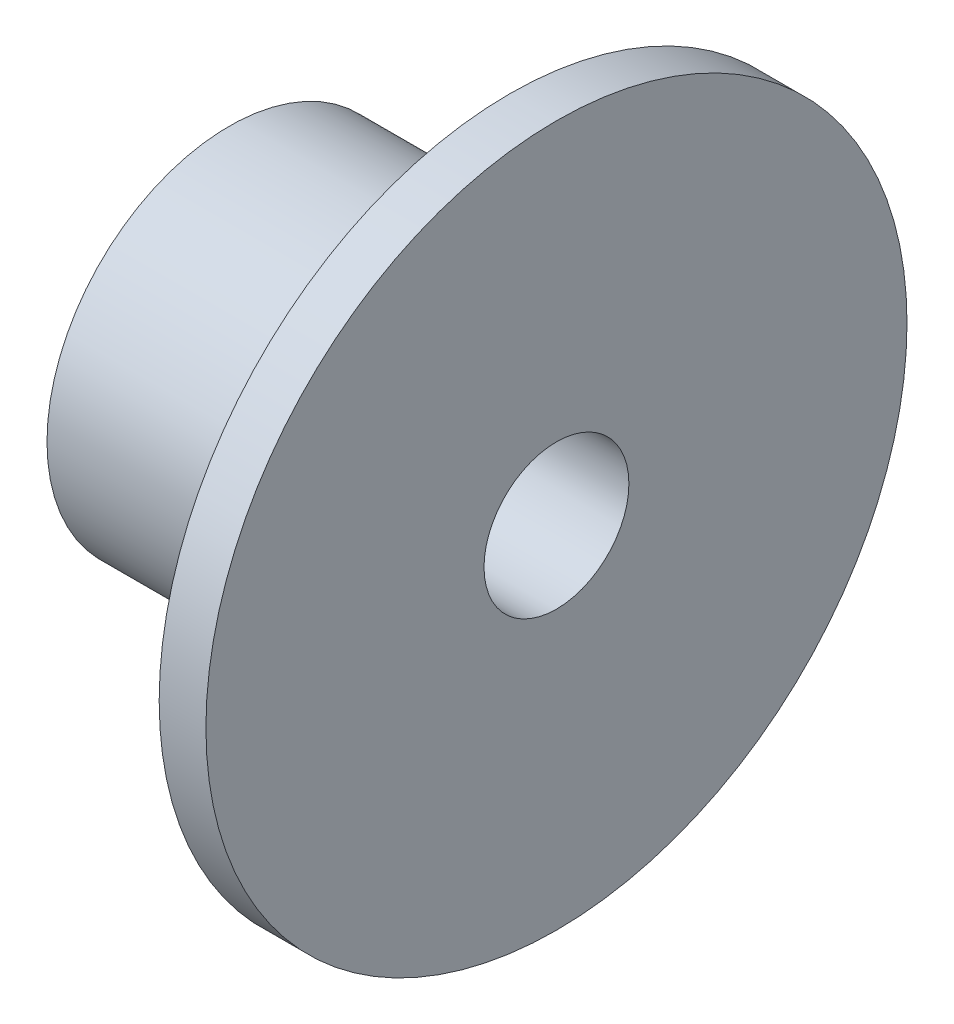
ISO-10303-21;
HEADER;
FILE_DESCRIPTION(('STEP AP214'),'2;1');
FILE_NAME('part.step','',(''),(''),'','','');
FILE_SCHEMA(('AUTOMOTIVE_DESIGN { 1 0 10303 214 1 1 1 1 }'));
ENDSEC;
DATA;
#1=APPLICATION_CONTEXT('core data for automotive mechanical design processes');
#2=APPLICATION_PROTOCOL_DEFINITION('international standard','automotive_design',2000,#1);
#3=PRODUCT_CONTEXT('',#1,'mechanical');
#4=PRODUCT('Part','Part','',(#3));
#5=PRODUCT_RELATED_PRODUCT_CATEGORY('part','',(#4));
#6=PRODUCT_DEFINITION_FORMATION('','',#4);
#7=PRODUCT_DEFINITION_CONTEXT('part definition',#1,'design');
#8=PRODUCT_DEFINITION('design','',#6,#7);
#9=PRODUCT_DEFINITION_SHAPE('','',#8);
#10=(LENGTH_UNIT() NAMED_UNIT(*) SI_UNIT(.MILLI.,.METRE.));
#11=(NAMED_UNIT(*) PLANE_ANGLE_UNIT() SI_UNIT($,.RADIAN.));
#12=(NAMED_UNIT(*) SI_UNIT($,.STERADIAN.) SOLID_ANGLE_UNIT());
#13=UNCERTAINTY_MEASURE_WITH_UNIT(LENGTH_MEASURE(1.E-05),#10,'distance_accuracy_value','');
#14=(GEOMETRIC_REPRESENTATION_CONTEXT(3) GLOBAL_UNCERTAINTY_ASSIGNED_CONTEXT((#13)) GLOBAL_UNIT_ASSIGNED_CONTEXT((#10,
#11,#12)) REPRESENTATION_CONTEXT('',''));
#15=CARTESIAN_POINT('',(0.,0.,0.));
#16=DIRECTION('',(0.,0.,1.));
#17=DIRECTION('',(1.,0.,0.));
#18=AXIS2_PLACEMENT_3D('',#15,#16,#17);
#19=CARTESIAN_POINT('',(6.,0.,0.));
#20=DIRECTION('',(-1.,0.,0.));
#21=DIRECTION('',(0.,0.,1.));
#22=AXIS2_PLACEMENT_3D('',#19,#20,#21);
#23=CYLINDRICAL_SURFACE('',#22,1.55);
#24=CARTESIAN_POINT('',(7.,0.,0.));
#25=DIRECTION('',(1.,0.,0.));
#26=DIRECTION('',(0.,0.,-1.));
#27=AXIS2_PLACEMENT_3D('',#24,#25,#26);
#28=CIRCLE('',#27,1.55);
#29=CARTESIAN_POINT('',(7.,0.,-1.55));
#30=VERTEX_POINT('',#29);
#31=EDGE_CURVE('E164',#30,#30,#28,.T.);
#32=ORIENTED_EDGE('',*,*,#31,.T.);
#33=EDGE_LOOP('',(#32));
#34=FACE_BOUND('',#33,.T.);
#35=CARTESIAN_POINT('',(3.,0.,0.));
#36=DIRECTION('',(-1.,0.,0.));
#37=DIRECTION('',(0.,0.,1.));
#38=AXIS2_PLACEMENT_3D('',#35,#36,#37);
#39=CIRCLE('',#38,1.55);
#40=CARTESIAN_POINT('',(3.,0.,1.55));
#41=VERTEX_POINT('',#40);
#42=EDGE_CURVE('E154',#41,#41,#39,.T.);
#43=ORIENTED_EDGE('',*,*,#42,.T.);
#44=EDGE_LOOP('',(#43));
#45=FACE_BOUND('',#44,.T.);
#46=ADVANCED_FACE('F39',(#34,#45),#23,.F.);
#47=CARTESIAN_POINT('',(0.,0.,0.));
#48=DIRECTION('',(1.,0.,0.));
#49=DIRECTION('',(0.,0.,-1.));
#50=AXIS2_PLACEMENT_3D('',#47,#48,#49);
#51=PLANE('',#50);
#52=DIRECTION('',(0.,0.866025403784439,0.5));
#53=VECTOR('',#52,1.);
#54=CARTESIAN_POINT('',(0.,-2.95,1.7031832941094));
#55=LINE('',#54,#53);
#56=CARTESIAN_POINT('',(0.,-2.95,1.7031832941094));
#57=VERTEX_POINT('',#56);
#58=CARTESIAN_POINT('',(0.,0.,3.40636658821879));
#59=VERTEX_POINT('',#58);
#60=EDGE_CURVE('E135',#57,#59,#55,.T.);
#61=ORIENTED_EDGE('',*,*,#60,.F.);
#62=DIRECTION('',(0.,0.,1.));
#63=VECTOR('',#62,1.);
#64=CARTESIAN_POINT('',(0.,-2.95,-1.7031832941094));
#65=LINE('',#64,#63);
#66=CARTESIAN_POINT('',(0.,-2.95,-1.7031832941094));
#67=VERTEX_POINT('',#66);
#68=EDGE_CURVE('E55',#67,#57,#65,.T.);
#69=ORIENTED_EDGE('',*,*,#68,.F.);
#70=DIRECTION('',(0.,-0.866025403784439,0.5));
#71=VECTOR('',#70,1.);
#72=CARTESIAN_POINT('',(0.,0.,-3.40636658821879));
#73=LINE('',#72,#71);
#74=CARTESIAN_POINT('',(0.,0.,-3.40636658821879));
#75=VERTEX_POINT('',#74);
#76=EDGE_CURVE('E148',#75,#67,#73,.T.);
#77=ORIENTED_EDGE('',*,*,#76,.F.);
#78=DIRECTION('',(0.,-0.866025403784439,-0.5));
#79=VECTOR('',#78,1.);
#80=CARTESIAN_POINT('',(0.,2.95,-1.7031832941094));
#81=LINE('',#80,#79);
#82=CARTESIAN_POINT('',(0.,2.95,-1.7031832941094));
#83=VERTEX_POINT('',#82);
#84=EDGE_CURVE('E145',#83,#75,#81,.T.);
#85=ORIENTED_EDGE('',*,*,#84,.F.);
#86=DIRECTION('',(0.,0.,-1.));
#87=VECTOR('',#86,1.);
#88=CARTESIAN_POINT('',(0.,2.95,1.7031832941094));
#89=LINE('',#88,#87);
#90=CARTESIAN_POINT('',(0.,2.95,1.7031832941094));
#91=VERTEX_POINT('',#90);
#92=EDGE_CURVE('E103',#91,#83,#89,.T.);
#93=ORIENTED_EDGE('',*,*,#92,.F.);
#94=DIRECTION('',(0.,0.866025403784438,-0.5));
#95=VECTOR('',#94,1.);
#96=CARTESIAN_POINT('',(0.,0.,3.40636658821879));
#97=LINE('',#96,#95);
#98=EDGE_CURVE('E139',#59,#91,#97,.T.);
#99=ORIENTED_EDGE('',*,*,#98,.F.);
#100=EDGE_LOOP('',(#61,#69,#77,#85,#93,#99));
#101=FACE_BOUND('',#100,.T.);
#102=CARTESIAN_POINT('',(0.,0.,0.));
#103=DIRECTION('',(1.,0.,0.));
#104=DIRECTION('',(0.,0.,-1.));
#105=AXIS2_PLACEMENT_3D('',#102,#103,#104);
#106=CIRCLE('',#105,3.9);
#107=CARTESIAN_POINT('',(0.,0.,-3.9));
#108=VERTEX_POINT('',#107);
#109=EDGE_CURVE('E173',#108,#108,#106,.T.);
#110=ORIENTED_EDGE('',*,*,#109,.F.);
#111=EDGE_LOOP('',(#110));
#112=FACE_BOUND('',#111,.T.);
#113=ADVANCED_FACE('F199',(#101,#112),#51,.F.);
#114=CARTESIAN_POINT('',(6.,0.,0.));
#115=DIRECTION('',(-1.,0.,0.));
#116=DIRECTION('',(0.,0.,1.));
#117=AXIS2_PLACEMENT_3D('',#114,#115,#116);
#118=CYLINDRICAL_SURFACE('',#117,3.9);
#119=CARTESIAN_POINT('',(5.,0.,0.));
#120=DIRECTION('',(1.,0.,0.));
#121=DIRECTION('',(0.,0.,-1.));
#122=AXIS2_PLACEMENT_3D('',#119,#120,#121);
#123=CIRCLE('',#122,3.9);
#124=CARTESIAN_POINT('',(5.,0.,-3.9));
#125=VERTEX_POINT('',#124);
#126=EDGE_CURVE('E11',#125,#125,#123,.F.);
#127=ORIENTED_EDGE('',*,*,#126,.T.);
#128=EDGE_LOOP('',(#127));
#129=FACE_BOUND('',#128,.T.);
#130=ORIENTED_EDGE('',*,*,#109,.T.);
#131=EDGE_LOOP('',(#130));
#132=FACE_BOUND('',#131,.T.);
#133=ADVANCED_FACE('F205',(#129,#132),#118,.T.);
#134=CARTESIAN_POINT('',(7.,0.,0.));
#135=DIRECTION('',(1.,0.,0.));
#136=DIRECTION('',(0.,0.,-1.));
#137=AXIS2_PLACEMENT_3D('',#134,#135,#136);
#138=PLANE('',#137);
#139=CARTESIAN_POINT('',(7.,0.,0.));
#140=DIRECTION('',(1.,0.,0.));
#141=DIRECTION('',(0.,0.,-1.));
#142=AXIS2_PLACEMENT_3D('',#139,#140,#141);
#143=CIRCLE('',#142,7.5);
#144=CARTESIAN_POINT('',(7.,0.,-7.5));
#145=VERTEX_POINT('',#144);
#146=EDGE_CURVE('E169',#145,#145,#143,.T.);
#147=ORIENTED_EDGE('',*,*,#146,.T.);
#148=EDGE_LOOP('',(#147));
#149=FACE_BOUND('',#148,.T.);
#150=ORIENTED_EDGE('',*,*,#31,.F.);
#151=EDGE_LOOP('',(#150));
#152=FACE_BOUND('',#151,.T.);
#153=ADVANCED_FACE('F213',(#149,#152),#138,.T.);
#154=CARTESIAN_POINT('',(6.,0.,0.));
#155=DIRECTION('',(1.,0.,0.));
#156=DIRECTION('',(0.,0.,-1.));
#157=AXIS2_PLACEMENT_3D('',#154,#155,#156);
#158=PLANE('',#157);
#159=CARTESIAN_POINT('',(6.,0.,0.));
#160=DIRECTION('',(1.,0.,0.));
#161=DIRECTION('',(0.,0.,-1.));
#162=AXIS2_PLACEMENT_3D('',#159,#160,#161);
#163=CIRCLE('',#162,4.9);
#164=CARTESIAN_POINT('',(6.,0.,-4.9));
#165=VERTEX_POINT('',#164);
#166=EDGE_CURVE('E48',#165,#165,#163,.T.);
#167=ORIENTED_EDGE('',*,*,#166,.T.);
#168=EDGE_LOOP('',(#167));
#169=FACE_BOUND('',#168,.T.);
#170=CARTESIAN_POINT('',(6.,0.,0.));
#171=DIRECTION('',(1.,0.,0.));
#172=DIRECTION('',(0.,0.,-1.));
#173=AXIS2_PLACEMENT_3D('',#170,#171,#172);
#174=CIRCLE('',#173,7.5);
#175=CARTESIAN_POINT('',(6.,0.,-7.5));
#176=VERTEX_POINT('',#175);
#177=EDGE_CURVE('E168',#176,#176,#174,.T.);
#178=ORIENTED_EDGE('',*,*,#177,.F.);
#179=EDGE_LOOP('',(#178));
#180=FACE_BOUND('',#179,.T.);
#181=ADVANCED_FACE('F186',(#169,#180),#158,.F.);
#182=CARTESIAN_POINT('',(7.,0.,0.));
#183=DIRECTION('',(-1.,0.,0.));
#184=DIRECTION('',(0.,0.,1.));
#185=AXIS2_PLACEMENT_3D('',#182,#183,#184);
#186=CYLINDRICAL_SURFACE('',#185,7.5);
#187=ORIENTED_EDGE('',*,*,#146,.F.);
#188=EDGE_LOOP('',(#187));
#189=FACE_BOUND('',#188,.T.);
#190=ORIENTED_EDGE('',*,*,#177,.T.);
#191=EDGE_LOOP('',(#190));
#192=FACE_BOUND('',#191,.T.);
#193=ADVANCED_FACE('F210',(#189,#192),#186,.T.);
#194=CARTESIAN_POINT('',(3.,-2.95,-1.7031832941094));
#195=DIRECTION('',(0.,-1.,0.));
#196=DIRECTION('',(0.,0.,-1.));
#197=AXIS2_PLACEMENT_3D('',#194,#195,#196);
#198=PLANE('',#197);
#199=ORIENTED_EDGE('',*,*,#68,.T.);
#200=DIRECTION('',(-1.,0.,0.));
#201=VECTOR('',#200,1.);
#202=CARTESIAN_POINT('',(3.,-2.95,1.7031832941094));
#203=LINE('',#202,#201);
#204=CARTESIAN_POINT('',(3.,-2.95,1.7031832941094));
#205=VERTEX_POINT('',#204);
#206=EDGE_CURVE('E85',#205,#57,#203,.T.);
#207=ORIENTED_EDGE('',*,*,#206,.F.);
#208=DIRECTION('',(0.,0.,1.));
#209=VECTOR('',#208,1.);
#210=CARTESIAN_POINT('',(3.,-2.95,-1.7031832941094));
#211=LINE('',#210,#209);
#212=CARTESIAN_POINT('',(3.,-2.95,-1.7031832941094));
#213=VERTEX_POINT('',#212);
#214=EDGE_CURVE('E151',#213,#205,#211,.T.);
#215=ORIENTED_EDGE('',*,*,#214,.F.);
#216=DIRECTION('',(-1.,0.,0.));
#217=VECTOR('',#216,1.);
#218=CARTESIAN_POINT('',(3.,-2.95,-1.7031832941094));
#219=LINE('',#218,#217);
#220=EDGE_CURVE('E63',#213,#67,#219,.T.);
#221=ORIENTED_EDGE('',*,*,#220,.T.);
#222=EDGE_LOOP('',(#199,#207,#215,#221));
#223=FACE_BOUND('',#222,.T.);
#224=ADVANCED_FACE('F228',(#223),#198,.F.);
#225=CARTESIAN_POINT('',(3.,0.,-3.40636658821879));
#226=DIRECTION('',(0.,-0.5,-0.866025403784439));
#227=DIRECTION('',(0.,0.866025403784439,-0.5));
#228=AXIS2_PLACEMENT_3D('',#225,#226,#227);
#229=PLANE('',#228);
#230=ORIENTED_EDGE('',*,*,#76,.T.);
#231=ORIENTED_EDGE('',*,*,#220,.F.);
#232=DIRECTION('',(0.,-0.866025403784439,0.5));
#233=VECTOR('',#232,1.);
#234=CARTESIAN_POINT('',(3.,0.,-3.40636658821879));
#235=LINE('',#234,#233);
#236=CARTESIAN_POINT('',(3.,0.,-3.40636658821879));
#237=VERTEX_POINT('',#236);
#238=EDGE_CURVE('E117',#237,#213,#235,.T.);
#239=ORIENTED_EDGE('',*,*,#238,.F.);
#240=DIRECTION('',(-1.,0.,0.));
#241=VECTOR('',#240,1.);
#242=CARTESIAN_POINT('',(3.,0.,-3.40636658821879));
#243=LINE('',#242,#241);
#244=EDGE_CURVE('E108',#237,#75,#243,.T.);
#245=ORIENTED_EDGE('',*,*,#244,.T.);
#246=EDGE_LOOP('',(#230,#231,#239,#245));
#247=FACE_BOUND('',#246,.T.);
#248=ADVANCED_FACE('F231',(#247),#229,.F.);
#249=CARTESIAN_POINT('',(3.,2.95,-1.7031832941094));
#250=DIRECTION('',(0.,0.5,-0.866025403784439));
#251=DIRECTION('',(0.,0.866025403784439,0.5));
#252=AXIS2_PLACEMENT_3D('',#249,#250,#251);
#253=PLANE('',#252);
#254=ORIENTED_EDGE('',*,*,#84,.T.);
#255=ORIENTED_EDGE('',*,*,#244,.F.);
#256=DIRECTION('',(0.,-0.866025403784439,-0.5));
#257=VECTOR('',#256,1.);
#258=CARTESIAN_POINT('',(3.,2.95,-1.7031832941094));
#259=LINE('',#258,#257);
#260=CARTESIAN_POINT('',(3.,2.95,-1.7031832941094));
#261=VERTEX_POINT('',#260);
#262=EDGE_CURVE('E112',#261,#237,#259,.T.);
#263=ORIENTED_EDGE('',*,*,#262,.F.);
#264=DIRECTION('',(-1.,0.,0.));
#265=VECTOR('',#264,1.);
#266=CARTESIAN_POINT('',(3.,2.95,-1.7031832941094));
#267=LINE('',#266,#265);
#268=EDGE_CURVE('E96',#261,#83,#267,.T.);
#269=ORIENTED_EDGE('',*,*,#268,.T.);
#270=EDGE_LOOP('',(#254,#255,#263,#269));
#271=FACE_BOUND('',#270,.T.);
#272=ADVANCED_FACE('F113',(#271),#253,.F.);
#273=CARTESIAN_POINT('',(3.,2.95,1.7031832941094));
#274=DIRECTION('',(0.,1.,0.));
#275=DIRECTION('',(0.,0.,1.));
#276=AXIS2_PLACEMENT_3D('',#273,#274,#275);
#277=PLANE('',#276);
#278=ORIENTED_EDGE('',*,*,#92,.T.);
#279=ORIENTED_EDGE('',*,*,#268,.F.);
#280=DIRECTION('',(0.,0.,-1.));
#281=VECTOR('',#280,1.);
#282=CARTESIAN_POINT('',(3.,2.95,1.7031832941094));
#283=LINE('',#282,#281);
#284=CARTESIAN_POINT('',(3.,2.95,1.7031832941094));
#285=VERTEX_POINT('',#284);
#286=EDGE_CURVE('E100',#285,#261,#283,.T.);
#287=ORIENTED_EDGE('',*,*,#286,.F.);
#288=DIRECTION('',(-1.,0.,0.));
#289=VECTOR('',#288,1.);
#290=CARTESIAN_POINT('',(3.,2.95,1.7031832941094));
#291=LINE('',#290,#289);
#292=EDGE_CURVE('E109',#285,#91,#291,.T.);
#293=ORIENTED_EDGE('',*,*,#292,.T.);
#294=EDGE_LOOP('',(#278,#279,#287,#293));
#295=FACE_BOUND('',#294,.T.);
#296=ADVANCED_FACE('F98',(#295),#277,.F.);
#297=CARTESIAN_POINT('',(3.,0.,3.40636658821879));
#298=DIRECTION('',(0.,0.5,0.866025403784439));
#299=DIRECTION('',(0.,-0.866025403784439,0.5));
#300=AXIS2_PLACEMENT_3D('',#297,#298,#299);
#301=PLANE('',#300);
#302=ORIENTED_EDGE('',*,*,#98,.T.);
#303=ORIENTED_EDGE('',*,*,#292,.F.);
#304=DIRECTION('',(0.,0.866025403784438,-0.5));
#305=VECTOR('',#304,1.);
#306=CARTESIAN_POINT('',(3.,0.,3.40636658821879));
#307=LINE('',#306,#305);
#308=CARTESIAN_POINT('',(3.,0.,3.40636658821879));
#309=VERTEX_POINT('',#308);
#310=EDGE_CURVE('E123',#309,#285,#307,.T.);
#311=ORIENTED_EDGE('',*,*,#310,.F.);
#312=DIRECTION('',(-1.,0.,0.));
#313=VECTOR('',#312,1.);
#314=CARTESIAN_POINT('',(3.,0.,3.40636658821879));
#315=LINE('',#314,#313);
#316=EDGE_CURVE('E159',#309,#59,#315,.T.);
#317=ORIENTED_EDGE('',*,*,#316,.T.);
#318=EDGE_LOOP('',(#302,#303,#311,#317));
#319=FACE_BOUND('',#318,.T.);
#320=ADVANCED_FACE('F234',(#319),#301,.F.);
#321=CARTESIAN_POINT('',(3.,-2.95,1.7031832941094));
#322=DIRECTION('',(0.,-0.5,0.866025403784439));
#323=DIRECTION('',(0.,-0.866025403784439,-0.5));
#324=AXIS2_PLACEMENT_3D('',#321,#322,#323);
#325=PLANE('',#324);
#326=ORIENTED_EDGE('',*,*,#60,.T.);
#327=ORIENTED_EDGE('',*,*,#316,.F.);
#328=DIRECTION('',(0.,0.866025403784439,0.5));
#329=VECTOR('',#328,1.);
#330=CARTESIAN_POINT('',(3.,-2.95,1.7031832941094));
#331=LINE('',#330,#329);
#332=EDGE_CURVE('E127',#205,#309,#331,.T.);
#333=ORIENTED_EDGE('',*,*,#332,.F.);
#334=ORIENTED_EDGE('',*,*,#206,.T.);
#335=EDGE_LOOP('',(#326,#327,#333,#334));
#336=FACE_BOUND('',#335,.T.);
#337=ADVANCED_FACE('F194',(#336),#325,.F.);
#338=CARTESIAN_POINT('',(3.,0.,0.));
#339=DIRECTION('',(-1.,0.,0.));
#340=DIRECTION('',(0.,0.,1.));
#341=AXIS2_PLACEMENT_3D('',#338,#339,#340);
#342=PLANE('',#341);
#343=ORIENTED_EDGE('',*,*,#42,.F.);
#344=EDGE_LOOP('',(#343));
#345=FACE_BOUND('',#344,.T.);
#346=ORIENTED_EDGE('',*,*,#214,.T.);
#347=ORIENTED_EDGE('',*,*,#332,.T.);
#348=ORIENTED_EDGE('',*,*,#310,.T.);
#349=ORIENTED_EDGE('',*,*,#286,.T.);
#350=ORIENTED_EDGE('',*,*,#262,.T.);
#351=ORIENTED_EDGE('',*,*,#238,.T.);
#352=EDGE_LOOP('',(#346,#347,#348,#349,#350,#351));
#353=FACE_BOUND('',#352,.T.);
#354=ADVANCED_FACE('F120',(#345,#353),#342,.T.);
#355=CARTESIAN_POINT('',(5.,0.,0.));
#356=DIRECTION('',(1.,0.,0.));
#357=DIRECTION('',(0.,0.,-1.));
#358=AXIS2_PLACEMENT_3D('',#355,#356,#357);
#359=TOROIDAL_SURFACE('',#358,4.9,1.);
#360=ORIENTED_EDGE('',*,*,#126,.F.);
#361=EDGE_LOOP('',(#360));
#362=FACE_BOUND('',#361,.T.);
#363=ORIENTED_EDGE('',*,*,#166,.F.);
#364=EDGE_LOOP('',(#363));
#365=FACE_BOUND('',#364,.T.);
#366=ADVANCED_FACE('F41',(#362,#365),#359,.F.);
#367=CLOSED_SHELL('',(#46,#113,#133,#153,#181,#193,#224,#248,#272,#296,#320,#337,#354,#366));
#368=MANIFOLD_SOLID_BREP('B2',#367);
#369=ADVANCED_BREP_SHAPE_REPRESENTATION('',(#18,#368),#14);
#370=SHAPE_DEFINITION_REPRESENTATION(#9,#369);
ENDSEC;
END-ISO-10303-21;
